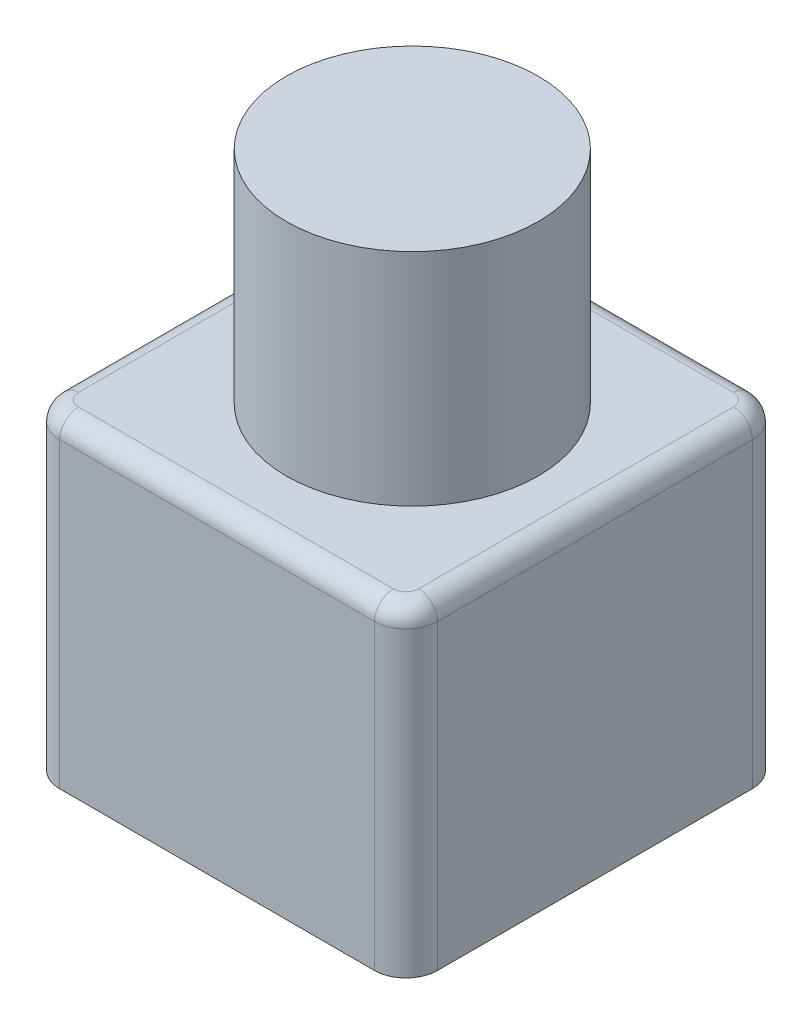
ISO-10303-21;
HEADER;
FILE_DESCRIPTION(('STEP AP214'),'2;1');
FILE_NAME('part.step','',(''),(''),'','','');
FILE_SCHEMA(('AUTOMOTIVE_DESIGN { 1 0 10303 214 1 1 1 1 }'));
ENDSEC;
DATA;
#1=APPLICATION_CONTEXT('core data for automotive mechanical design processes');
#2=APPLICATION_PROTOCOL_DEFINITION('international standard','automotive_design',2000,#1);
#3=PRODUCT_CONTEXT('',#1,'mechanical');
#4=PRODUCT('Part','Part','',(#3));
#5=PRODUCT_RELATED_PRODUCT_CATEGORY('part','',(#4));
#6=PRODUCT_DEFINITION_FORMATION('','',#4);
#7=PRODUCT_DEFINITION_CONTEXT('part definition',#1,'design');
#8=PRODUCT_DEFINITION('design','',#6,#7);
#9=PRODUCT_DEFINITION_SHAPE('','',#8);
#10=(LENGTH_UNIT() NAMED_UNIT(*) SI_UNIT(.MILLI.,.METRE.));
#11=(NAMED_UNIT(*) PLANE_ANGLE_UNIT() SI_UNIT($,.RADIAN.));
#12=(NAMED_UNIT(*) SI_UNIT($,.STERADIAN.) SOLID_ANGLE_UNIT());
#13=UNCERTAINTY_MEASURE_WITH_UNIT(LENGTH_MEASURE(1.E-05),#10,'distance_accuracy_value','');
#14=(GEOMETRIC_REPRESENTATION_CONTEXT(3) GLOBAL_UNCERTAINTY_ASSIGNED_CONTEXT((#13)) GLOBAL_UNIT_ASSIGNED_CONTEXT((#10,
#11,#12)) REPRESENTATION_CONTEXT('',''));
#15=CARTESIAN_POINT('',(0.,0.,0.));
#16=DIRECTION('',(0.,0.,1.));
#17=DIRECTION('',(1.,0.,0.));
#18=AXIS2_PLACEMENT_3D('',#15,#16,#17);
#19=CARTESIAN_POINT('',(-30.,51.,-30.));
#20=DIRECTION('',(1.,0.,0.));
#21=DIRECTION('',(0.,0.,-1.));
#22=AXIS2_PLACEMENT_3D('',#19,#20,#21);
#23=PLANE('',#22);
#24=DIRECTION('',(0.,-1.,0.));
#25=VECTOR('',#24,1.);
#26=CARTESIAN_POINT('',(-30.,51.,25.));
#27=LINE('',#26,#25);
#28=CARTESIAN_POINT('',(-30.,0.,25.));
#29=VERTEX_POINT('',#28);
#30=CARTESIAN_POINT('',(-30.,48.,25.));
#31=VERTEX_POINT('',#30);
#32=EDGE_CURVE('E267',#29,#31,#27,.F.);
#33=ORIENTED_EDGE('',*,*,#32,.T.);
#34=DIRECTION('',(0.,0.,1.));
#35=VECTOR('',#34,1.);
#36=CARTESIAN_POINT('',(-30.,48.,-25.));
#37=LINE('',#36,#35);
#38=CARTESIAN_POINT('',(-30.,48.,-25.));
#39=VERTEX_POINT('',#38);
#40=EDGE_CURVE('E11',#31,#39,#37,.F.);
#41=ORIENTED_EDGE('',*,*,#40,.T.);
#42=DIRECTION('',(0.,-1.,0.));
#43=VECTOR('',#42,1.);
#44=CARTESIAN_POINT('',(-30.,51.,-25.));
#45=LINE('',#44,#43);
#46=CARTESIAN_POINT('',(-30.,0.,-25.));
#47=VERTEX_POINT('',#46);
#48=EDGE_CURVE('E270',#39,#47,#45,.T.);
#49=ORIENTED_EDGE('',*,*,#48,.T.);
#50=DIRECTION('',(0.,0.,1.));
#51=VECTOR('',#50,1.);
#52=CARTESIAN_POINT('',(-30.,0.,-30.));
#53=LINE('',#52,#51);
#54=EDGE_CURVE('E229',#47,#29,#53,.T.);
#55=ORIENTED_EDGE('',*,*,#54,.T.);
#56=EDGE_LOOP('',(#33,#41,#49,#55));
#57=FACE_BOUND('',#56,.T.);
#58=DIRECTION('',(0.,1.,0.));
#59=VECTOR('',#58,1.);
#60=CARTESIAN_POINT('',(-30.,45.,15.));
#61=LINE('',#60,#59);
#62=CARTESIAN_POINT('',(-30.,20.,15.));
#63=VERTEX_POINT('',#62);
#64=CARTESIAN_POINT('',(-30.,45.,15.));
#65=VERTEX_POINT('',#64);
#66=EDGE_CURVE('E196',#63,#65,#61,.T.);
#67=ORIENTED_EDGE('',*,*,#66,.F.);
#68=DIRECTION('',(0.,0.,1.));
#69=VECTOR('',#68,1.);
#70=CARTESIAN_POINT('',(-30.,20.,-15.));
#71=LINE('',#70,#69);
#72=CARTESIAN_POINT('',(-30.,20.,-15.));
#73=VERTEX_POINT('',#72);
#74=EDGE_CURVE('E190',#73,#63,#71,.T.);
#75=ORIENTED_EDGE('',*,*,#74,.F.);
#76=DIRECTION('',(0.,-1.,0.));
#77=VECTOR('',#76,1.);
#78=CARTESIAN_POINT('',(-30.,45.,-15.));
#79=LINE('',#78,#77);
#80=CARTESIAN_POINT('',(-30.,45.,-15.));
#81=VERTEX_POINT('',#80);
#82=EDGE_CURVE('E174',#81,#73,#79,.T.);
#83=ORIENTED_EDGE('',*,*,#82,.F.);
#84=DIRECTION('',(0.,0.,-1.));
#85=VECTOR('',#84,1.);
#86=CARTESIAN_POINT('',(-30.,45.,-15.));
#87=LINE('',#86,#85);
#88=EDGE_CURVE('E187',#65,#81,#87,.T.);
#89=ORIENTED_EDGE('',*,*,#88,.F.);
#90=EDGE_LOOP('',(#67,#75,#83,#89));
#91=FACE_BOUND('',#90,.T.);
#92=ADVANCED_FACE('F41',(#57,#91),#23,.F.);
#93=CARTESIAN_POINT('',(30.,51.,-30.));
#94=DIRECTION('',(-1.,0.,0.));
#95=DIRECTION('',(0.,0.,1.));
#96=AXIS2_PLACEMENT_3D('',#93,#94,#95);
#97=PLANE('',#96);
#98=DIRECTION('',(0.,-1.,0.));
#99=VECTOR('',#98,1.);
#100=CARTESIAN_POINT('',(30.,51.,-25.));
#101=LINE('',#100,#99);
#102=CARTESIAN_POINT('',(30.,0.,-25.));
#103=VERTEX_POINT('',#102);
#104=CARTESIAN_POINT('',(30.,48.,-25.));
#105=VERTEX_POINT('',#104);
#106=EDGE_CURVE('E257',#103,#105,#101,.F.);
#107=ORIENTED_EDGE('',*,*,#106,.T.);
#108=DIRECTION('',(0.,0.,-1.));
#109=VECTOR('',#108,1.);
#110=CARTESIAN_POINT('',(30.,48.,25.));
#111=LINE('',#110,#109);
#112=CARTESIAN_POINT('',(30.,48.,25.));
#113=VERTEX_POINT('',#112);
#114=EDGE_CURVE('E350',#105,#113,#111,.F.);
#115=ORIENTED_EDGE('',*,*,#114,.T.);
#116=DIRECTION('',(0.,-1.,0.));
#117=VECTOR('',#116,1.);
#118=CARTESIAN_POINT('',(30.,51.,25.));
#119=LINE('',#118,#117);
#120=CARTESIAN_POINT('',(30.,0.,25.));
#121=VERTEX_POINT('',#120);
#122=EDGE_CURVE('E254',#113,#121,#119,.T.);
#123=ORIENTED_EDGE('',*,*,#122,.T.);
#124=DIRECTION('',(0.,0.,-1.));
#125=VECTOR('',#124,1.);
#126=CARTESIAN_POINT('',(30.,0.,-30.));
#127=LINE('',#126,#125);
#128=EDGE_CURVE('E215',#121,#103,#127,.T.);
#129=ORIENTED_EDGE('',*,*,#128,.T.);
#130=EDGE_LOOP('',(#107,#115,#123,#129));
#131=FACE_BOUND('',#130,.T.);
#132=ADVANCED_FACE('F409',(#131),#97,.F.);
#133=CARTESIAN_POINT('',(-30.,51.,-30.));
#134=DIRECTION('',(0.,0.,1.));
#135=DIRECTION('',(1.,0.,0.));
#136=AXIS2_PLACEMENT_3D('',#133,#134,#135);
#137=PLANE('',#136);
#138=DIRECTION('',(0.,-1.,0.));
#139=VECTOR('',#138,1.);
#140=CARTESIAN_POINT('',(-25.,51.,-30.));
#141=LINE('',#140,#139);
#142=CARTESIAN_POINT('',(-25.,0.,-30.));
#143=VERTEX_POINT('',#142);
#144=CARTESIAN_POINT('',(-25.,48.,-30.));
#145=VERTEX_POINT('',#144);
#146=EDGE_CURVE('E220',#143,#145,#141,.F.);
#147=ORIENTED_EDGE('',*,*,#146,.T.);
#148=DIRECTION('',(-1.,0.,0.));
#149=VECTOR('',#148,1.);
#150=CARTESIAN_POINT('',(25.,48.,-30.));
#151=LINE('',#150,#149);
#152=CARTESIAN_POINT('',(25.,48.,-30.));
#153=VERTEX_POINT('',#152);
#154=EDGE_CURVE('E347',#145,#153,#151,.F.);
#155=ORIENTED_EDGE('',*,*,#154,.T.);
#156=DIRECTION('',(0.,-1.,0.));
#157=VECTOR('',#156,1.);
#158=CARTESIAN_POINT('',(25.,51.,-30.));
#159=LINE('',#158,#157);
#160=CARTESIAN_POINT('',(25.,0.,-30.));
#161=VERTEX_POINT('',#160);
#162=EDGE_CURVE('E239',#153,#161,#159,.T.);
#163=ORIENTED_EDGE('',*,*,#162,.T.);
#164=DIRECTION('',(-1.,0.,0.));
#165=VECTOR('',#164,1.);
#166=CARTESIAN_POINT('',(-30.,0.,-30.));
#167=LINE('',#166,#165);
#168=EDGE_CURVE('E225',#161,#143,#167,.T.);
#169=ORIENTED_EDGE('',*,*,#168,.T.);
#170=EDGE_LOOP('',(#147,#155,#163,#169));
#171=FACE_BOUND('',#170,.T.);
#172=ADVANCED_FACE('F459',(#171),#137,.F.);
#173=CARTESIAN_POINT('',(-30.,51.,30.));
#174=DIRECTION('',(0.,0.,-1.));
#175=DIRECTION('',(-1.,0.,0.));
#176=AXIS2_PLACEMENT_3D('',#173,#174,#175);
#177=PLANE('',#176);
#178=DIRECTION('',(0.,-1.,0.));
#179=VECTOR('',#178,1.);
#180=CARTESIAN_POINT('',(25.,51.,30.));
#181=LINE('',#180,#179);
#182=CARTESIAN_POINT('',(25.,0.,30.));
#183=VERTEX_POINT('',#182);
#184=CARTESIAN_POINT('',(25.,48.,30.));
#185=VERTEX_POINT('',#184);
#186=EDGE_CURVE('E264',#183,#185,#181,.F.);
#187=ORIENTED_EDGE('',*,*,#186,.T.);
#188=DIRECTION('',(1.,0.,0.));
#189=VECTOR('',#188,1.);
#190=CARTESIAN_POINT('',(-25.,48.,30.));
#191=LINE('',#190,#189);
#192=CARTESIAN_POINT('',(-25.,48.,30.));
#193=VERTEX_POINT('',#192);
#194=EDGE_CURVE('E51',#185,#193,#191,.F.);
#195=ORIENTED_EDGE('',*,*,#194,.T.);
#196=DIRECTION('',(0.,-1.,0.));
#197=VECTOR('',#196,1.);
#198=CARTESIAN_POINT('',(-25.,51.,30.));
#199=LINE('',#198,#197);
#200=CARTESIAN_POINT('',(-25.,0.,30.));
#201=VERTEX_POINT('',#200);
#202=EDGE_CURVE('E261',#193,#201,#199,.T.);
#203=ORIENTED_EDGE('',*,*,#202,.T.);
#204=DIRECTION('',(1.,0.,0.));
#205=VECTOR('',#204,1.);
#206=CARTESIAN_POINT('',(-30.,0.,30.));
#207=LINE('',#206,#205);
#208=EDGE_CURVE('E221',#201,#183,#207,.T.);
#209=ORIENTED_EDGE('',*,*,#208,.T.);
#210=EDGE_LOOP('',(#187,#195,#203,#209));
#211=FACE_BOUND('',#210,.T.);
#212=ADVANCED_FACE('F398',(#211),#177,.F.);
#213=CARTESIAN_POINT('',(0.,51.,0.));
#214=DIRECTION('',(0.,1.,0.));
#215=DIRECTION('',(0.,0.,1.));
#216=AXIS2_PLACEMENT_3D('',#213,#214,#215);
#217=PLANE('',#216);
#218=CARTESIAN_POINT('',(25.,51.,25.));
#219=DIRECTION('',(0.,1.,0.));
#220=DIRECTION('',(0.,0.,1.));
#221=AXIS2_PLACEMENT_3D('',#218,#219,#220);
#222=CIRCLE('',#221,2.);
#223=CARTESIAN_POINT('',(25.,51.,27.));
#224=VERTEX_POINT('',#223);
#225=CARTESIAN_POINT('',(27.,51.,25.));
#226=VERTEX_POINT('',#225);
#227=EDGE_CURVE('E326',#224,#226,#222,.T.);
#228=ORIENTED_EDGE('',*,*,#227,.T.);
#229=DIRECTION('',(0.,0.,-1.));
#230=VECTOR('',#229,1.);
#231=CARTESIAN_POINT('',(27.,51.,-25.));
#232=LINE('',#231,#230);
#233=CARTESIAN_POINT('',(27.,51.,-25.));
#234=VERTEX_POINT('',#233);
#235=EDGE_CURVE('E332',#226,#234,#232,.T.);
#236=ORIENTED_EDGE('',*,*,#235,.T.);
#237=CARTESIAN_POINT('',(25.,51.,-25.));
#238=DIRECTION('',(0.,1.,0.));
#239=DIRECTION('',(0.,0.,1.));
#240=AXIS2_PLACEMENT_3D('',#237,#238,#239);
#241=CIRCLE('',#240,2.);
#242=CARTESIAN_POINT('',(25.,51.,-27.));
#243=VERTEX_POINT('',#242);
#244=EDGE_CURVE('E329',#234,#243,#241,.T.);
#245=ORIENTED_EDGE('',*,*,#244,.T.);
#246=DIRECTION('',(-1.,0.,0.));
#247=VECTOR('',#246,1.);
#248=CARTESIAN_POINT('',(-25.,51.,-27.));
#249=LINE('',#248,#247);
#250=CARTESIAN_POINT('',(-25.,51.,-27.));
#251=VERTEX_POINT('',#250);
#252=EDGE_CURVE('E323',#243,#251,#249,.T.);
#253=ORIENTED_EDGE('',*,*,#252,.T.);
#254=CARTESIAN_POINT('',(-25.,51.,-25.));
#255=DIRECTION('',(0.,1.,0.));
#256=DIRECTION('',(0.,0.,1.));
#257=AXIS2_PLACEMENT_3D('',#254,#255,#256);
#258=CIRCLE('',#257,2.);
#259=CARTESIAN_POINT('',(-27.,51.,-25.));
#260=VERTEX_POINT('',#259);
#261=EDGE_CURVE('E316',#251,#260,#258,.T.);
#262=ORIENTED_EDGE('',*,*,#261,.T.);
#263=DIRECTION('',(0.,0.,1.));
#264=VECTOR('',#263,1.);
#265=CARTESIAN_POINT('',(-27.,51.,25.));
#266=LINE('',#265,#264);
#267=CARTESIAN_POINT('',(-27.,51.,25.));
#268=VERTEX_POINT('',#267);
#269=EDGE_CURVE('E297',#260,#268,#266,.T.);
#270=ORIENTED_EDGE('',*,*,#269,.T.);
#271=CARTESIAN_POINT('',(-25.,51.,25.));
#272=DIRECTION('',(0.,1.,0.));
#273=DIRECTION('',(0.,0.,1.));
#274=AXIS2_PLACEMENT_3D('',#271,#272,#273);
#275=CIRCLE('',#274,2.);
#276=CARTESIAN_POINT('',(-25.,51.,27.));
#277=VERTEX_POINT('',#276);
#278=EDGE_CURVE('E313',#268,#277,#275,.T.);
#279=ORIENTED_EDGE('',*,*,#278,.T.);
#280=DIRECTION('',(1.,0.,0.));
#281=VECTOR('',#280,1.);
#282=CARTESIAN_POINT('',(25.,51.,27.));
#283=LINE('',#282,#281);
#284=EDGE_CURVE('E320',#277,#224,#283,.T.);
#285=ORIENTED_EDGE('',*,*,#284,.T.);
#286=EDGE_LOOP('',(#228,#236,#245,#253,#262,#270,#279,#285));
#287=FACE_BOUND('',#286,.T.);
#288=CARTESIAN_POINT('',(1.,51.,0.));
#289=DIRECTION('',(0.,1.,0.));
#290=DIRECTION('',(0.,0.,1.));
#291=AXIS2_PLACEMENT_3D('',#288,#289,#290);
#292=CIRCLE('',#291,20.);
#293=CARTESIAN_POINT('',(1.,51.,20.));
#294=VERTEX_POINT('',#293);
#295=EDGE_CURVE('E216',#294,#294,#292,.T.);
#296=ORIENTED_EDGE('',*,*,#295,.F.);
#297=EDGE_LOOP('',(#296));
#298=FACE_BOUND('',#297,.T.);
#299=ADVANCED_FACE('F425',(#287,#298),#217,.T.);
#300=CARTESIAN_POINT('',(0.,0.,0.));
#301=DIRECTION('',(0.,1.,0.));
#302=DIRECTION('',(0.,0.,1.));
#303=AXIS2_PLACEMENT_3D('',#300,#301,#302);
#304=PLANE('',#303);
#305=ORIENTED_EDGE('',*,*,#168,.F.);
#306=CARTESIAN_POINT('',(25.,0.,-25.));
#307=DIRECTION('',(0.,1.,0.));
#308=DIRECTION('',(0.,0.,1.));
#309=AXIS2_PLACEMENT_3D('',#306,#307,#308);
#310=CIRCLE('',#309,5.);
#311=EDGE_CURVE('E251',#161,#103,#310,.F.);
#312=ORIENTED_EDGE('',*,*,#311,.T.);
#313=ORIENTED_EDGE('',*,*,#128,.F.);
#314=CARTESIAN_POINT('',(25.,0.,25.));
#315=DIRECTION('',(0.,1.,0.));
#316=DIRECTION('',(0.,0.,1.));
#317=AXIS2_PLACEMENT_3D('',#314,#315,#316);
#318=CIRCLE('',#317,5.);
#319=EDGE_CURVE('E248',#121,#183,#318,.F.);
#320=ORIENTED_EDGE('',*,*,#319,.T.);
#321=ORIENTED_EDGE('',*,*,#208,.F.);
#322=CARTESIAN_POINT('',(-25.,0.,25.));
#323=DIRECTION('',(0.,1.,0.));
#324=DIRECTION('',(0.,0.,1.));
#325=AXIS2_PLACEMENT_3D('',#322,#323,#324);
#326=CIRCLE('',#325,5.);
#327=EDGE_CURVE('E242',#201,#29,#326,.F.);
#328=ORIENTED_EDGE('',*,*,#327,.T.);
#329=ORIENTED_EDGE('',*,*,#54,.F.);
#330=CARTESIAN_POINT('',(-25.,0.,-25.));
#331=DIRECTION('',(0.,1.,0.));
#332=DIRECTION('',(0.,0.,1.));
#333=AXIS2_PLACEMENT_3D('',#330,#331,#332);
#334=CIRCLE('',#333,5.);
#335=EDGE_CURVE('E245',#47,#143,#334,.F.);
#336=ORIENTED_EDGE('',*,*,#335,.T.);
#337=EDGE_LOOP('',(#305,#312,#313,#320,#321,#328,#329,#336));
#338=FACE_BOUND('',#337,.T.);
#339=ADVANCED_FACE('F403',(#338),#304,.F.);
#340=CARTESIAN_POINT('',(1.,86.,0.));
#341=DIRECTION('',(0.,-1.,0.));
#342=DIRECTION('',(0.,0.,-1.));
#343=AXIS2_PLACEMENT_3D('',#340,#341,#342);
#344=CYLINDRICAL_SURFACE('',#343,20.);
#345=CARTESIAN_POINT('',(1.,86.,0.));
#346=DIRECTION('',(0.,1.,0.));
#347=DIRECTION('',(0.,0.,1.));
#348=AXIS2_PLACEMENT_3D('',#345,#346,#347);
#349=CIRCLE('',#348,20.);
#350=CARTESIAN_POINT('',(1.,86.,20.));
#351=VERTEX_POINT('',#350);
#352=EDGE_CURVE('E211',#351,#351,#349,.T.);
#353=ORIENTED_EDGE('',*,*,#352,.F.);
#354=EDGE_LOOP('',(#353));
#355=FACE_BOUND('',#354,.T.);
#356=ORIENTED_EDGE('',*,*,#295,.T.);
#357=EDGE_LOOP('',(#356));
#358=FACE_BOUND('',#357,.T.);
#359=ADVANCED_FACE('F517',(#355,#358),#344,.T.);
#360=CARTESIAN_POINT('',(1.,86.,0.));
#361=DIRECTION('',(0.,1.,0.));
#362=DIRECTION('',(0.,0.,1.));
#363=AXIS2_PLACEMENT_3D('',#360,#361,#362);
#364=PLANE('',#363);
#365=ORIENTED_EDGE('',*,*,#352,.T.);
#366=EDGE_LOOP('',(#365));
#367=FACE_BOUND('',#366,.T.);
#368=ADVANCED_FACE('F510',(#367),#364,.T.);
#369=CARTESIAN_POINT('',(-32.,45.,15.));
#370=DIRECTION('',(0.,0.,-1.));
#371=DIRECTION('',(0.,1.,0.));
#372=AXIS2_PLACEMENT_3D('',#369,#370,#371);
#373=PLANE('',#372);
#374=DIRECTION('',(1.,0.,0.));
#375=VECTOR('',#374,1.);
#376=CARTESIAN_POINT('',(-32.,45.,15.));
#377=LINE('',#376,#375);
#378=CARTESIAN_POINT('',(-31.5,45.,15.));
#379=VERTEX_POINT('',#378);
#380=EDGE_CURVE('E180',#379,#65,#377,.T.);
#381=ORIENTED_EDGE('',*,*,#380,.F.);
#382=DIRECTION('',(0.,1.,0.));
#383=VECTOR('',#382,1.);
#384=CARTESIAN_POINT('',(-31.5,20.,15.));
#385=LINE('',#384,#383);
#386=CARTESIAN_POINT('',(-31.5,20.,15.));
#387=VERTEX_POINT('',#386);
#388=EDGE_CURVE('E291',#379,#387,#385,.F.);
#389=ORIENTED_EDGE('',*,*,#388,.T.);
#390=DIRECTION('',(1.,0.,0.));
#391=VECTOR('',#390,1.);
#392=CARTESIAN_POINT('',(-32.,20.,15.));
#393=LINE('',#392,#391);
#394=EDGE_CURVE('E204',#387,#63,#393,.T.);
#395=ORIENTED_EDGE('',*,*,#394,.T.);
#396=ORIENTED_EDGE('',*,*,#66,.T.);
#397=EDGE_LOOP('',(#381,#389,#395,#396));
#398=FACE_BOUND('',#397,.T.);
#399=ADVANCED_FACE('F508',(#398),#373,.F.);
#400=CARTESIAN_POINT('',(-32.,45.,-15.));
#401=DIRECTION('',(0.,-1.,0.));
#402=DIRECTION('',(0.,0.,-1.));
#403=AXIS2_PLACEMENT_3D('',#400,#401,#402);
#404=PLANE('',#403);
#405=DIRECTION('',(1.,0.,0.));
#406=VECTOR('',#405,1.);
#407=CARTESIAN_POINT('',(-32.,45.,-15.));
#408=LINE('',#407,#406);
#409=CARTESIAN_POINT('',(-31.5,45.,-15.));
#410=VERTEX_POINT('',#409);
#411=EDGE_CURVE('E170',#410,#81,#408,.T.);
#412=ORIENTED_EDGE('',*,*,#411,.F.);
#413=DIRECTION('',(0.,0.,-1.));
#414=VECTOR('',#413,1.);
#415=CARTESIAN_POINT('',(-31.5,45.,15.));
#416=LINE('',#415,#414);
#417=EDGE_CURVE('E294',#410,#379,#416,.F.);
#418=ORIENTED_EDGE('',*,*,#417,.T.);
#419=ORIENTED_EDGE('',*,*,#380,.T.);
#420=ORIENTED_EDGE('',*,*,#88,.T.);
#421=EDGE_LOOP('',(#412,#418,#419,#420));
#422=FACE_BOUND('',#421,.T.);
#423=ADVANCED_FACE('F193',(#422),#404,.F.);
#424=CARTESIAN_POINT('',(-32.,45.,-15.));
#425=DIRECTION('',(0.,0.,1.));
#426=DIRECTION('',(1.,0.,0.));
#427=AXIS2_PLACEMENT_3D('',#424,#425,#426);
#428=PLANE('',#427);
#429=DIRECTION('',(1.,0.,0.));
#430=VECTOR('',#429,1.);
#431=CARTESIAN_POINT('',(-32.,20.,-15.));
#432=LINE('',#431,#430);
#433=CARTESIAN_POINT('',(-31.5,20.,-15.));
#434=VERTEX_POINT('',#433);
#435=EDGE_CURVE('E181',#434,#73,#432,.T.);
#436=ORIENTED_EDGE('',*,*,#435,.F.);
#437=DIRECTION('',(0.,-1.,0.));
#438=VECTOR('',#437,1.);
#439=CARTESIAN_POINT('',(-31.5,45.,-15.));
#440=LINE('',#439,#438);
#441=EDGE_CURVE('E176',#434,#410,#440,.F.);
#442=ORIENTED_EDGE('',*,*,#441,.T.);
#443=ORIENTED_EDGE('',*,*,#411,.T.);
#444=ORIENTED_EDGE('',*,*,#82,.T.);
#445=EDGE_LOOP('',(#436,#442,#443,#444));
#446=FACE_BOUND('',#445,.T.);
#447=ADVANCED_FACE('F173',(#446),#428,.F.);
#448=CARTESIAN_POINT('',(-32.,20.,-15.));
#449=DIRECTION('',(0.,1.,0.));
#450=DIRECTION('',(0.,0.,1.));
#451=AXIS2_PLACEMENT_3D('',#448,#449,#450);
#452=PLANE('',#451);
#453=ORIENTED_EDGE('',*,*,#394,.F.);
#454=DIRECTION('',(0.,0.,1.));
#455=VECTOR('',#454,1.);
#456=CARTESIAN_POINT('',(-31.5,20.,-15.));
#457=LINE('',#456,#455);
#458=EDGE_CURVE('E288',#387,#434,#457,.F.);
#459=ORIENTED_EDGE('',*,*,#458,.T.);
#460=ORIENTED_EDGE('',*,*,#435,.T.);
#461=ORIENTED_EDGE('',*,*,#74,.T.);
#462=EDGE_LOOP('',(#453,#459,#460,#461));
#463=FACE_BOUND('',#462,.T.);
#464=ADVANCED_FACE('F502',(#463),#452,.F.);
#465=CARTESIAN_POINT('',(-32.,0.,0.));
#466=DIRECTION('',(-1.,0.,0.));
#467=DIRECTION('',(0.,-1.,0.));
#468=AXIS2_PLACEMENT_3D('',#465,#466,#467);
#469=PLANE('',#468);
#470=DIRECTION('',(0.,0.,-1.));
#471=VECTOR('',#470,1.);
#472=CARTESIAN_POINT('',(-32.,44.5,-15.));
#473=LINE('',#472,#471);
#474=CARTESIAN_POINT('',(-32.,44.5,14.5));
#475=VERTEX_POINT('',#474);
#476=CARTESIAN_POINT('',(-32.,44.5,-14.5));
#477=VERTEX_POINT('',#476);
#478=EDGE_CURVE('E273',#475,#477,#473,.T.);
#479=ORIENTED_EDGE('',*,*,#478,.T.);
#480=DIRECTION('',(0.,-1.,0.));
#481=VECTOR('',#480,1.);
#482=CARTESIAN_POINT('',(-32.,20.,-14.5));
#483=LINE('',#482,#481);
#484=CARTESIAN_POINT('',(-32.,20.5,-14.5));
#485=VERTEX_POINT('',#484);
#486=EDGE_CURVE('E282',#477,#485,#483,.T.);
#487=ORIENTED_EDGE('',*,*,#486,.T.);
#488=DIRECTION('',(0.,0.,1.));
#489=VECTOR('',#488,1.);
#490=CARTESIAN_POINT('',(-32.,20.5,15.));
#491=LINE('',#490,#489);
#492=CARTESIAN_POINT('',(-32.,20.5,14.5));
#493=VERTEX_POINT('',#492);
#494=EDGE_CURVE('E279',#485,#493,#491,.T.);
#495=ORIENTED_EDGE('',*,*,#494,.T.);
#496=DIRECTION('',(0.,1.,0.));
#497=VECTOR('',#496,1.);
#498=CARTESIAN_POINT('',(-32.,45.,14.5));
#499=LINE('',#498,#497);
#500=EDGE_CURVE('E276',#493,#475,#499,.T.);
#501=ORIENTED_EDGE('',*,*,#500,.T.);
#502=EDGE_LOOP('',(#479,#487,#495,#501));
#503=FACE_BOUND('',#502,.T.);
#504=ADVANCED_FACE('F469',(#503),#469,.T.);
#505=CARTESIAN_POINT('',(25.,51.,-25.));
#506=DIRECTION('',(0.,-1.,0.));
#507=DIRECTION('',(0.,0.,-1.));
#508=AXIS2_PLACEMENT_3D('',#505,#506,#507);
#509=CYLINDRICAL_SURFACE('',#508,5.);
#510=ORIENTED_EDGE('',*,*,#162,.F.);
#511=CARTESIAN_POINT('',(25.,48.,-25.));
#512=DIRECTION('',(0.,1.,0.));
#513=DIRECTION('',(0.,0.,1.));
#514=AXIS2_PLACEMENT_3D('',#511,#512,#513);
#515=CIRCLE('',#514,5.);
#516=EDGE_CURVE('E339',#153,#105,#515,.F.);
#517=ORIENTED_EDGE('',*,*,#516,.T.);
#518=ORIENTED_EDGE('',*,*,#106,.F.);
#519=ORIENTED_EDGE('',*,*,#311,.F.);
#520=EDGE_LOOP('',(#510,#517,#518,#519));
#521=FACE_BOUND('',#520,.T.);
#522=ADVANCED_FACE('F412',(#521),#509,.T.);
#523=CARTESIAN_POINT('',(25.,51.,25.));
#524=DIRECTION('',(0.,-1.,0.));
#525=DIRECTION('',(0.,0.,-1.));
#526=AXIS2_PLACEMENT_3D('',#523,#524,#525);
#527=CYLINDRICAL_SURFACE('',#526,5.);
#528=ORIENTED_EDGE('',*,*,#122,.F.);
#529=CARTESIAN_POINT('',(25.,48.,25.));
#530=DIRECTION('',(0.,1.,0.));
#531=DIRECTION('',(0.,0.,1.));
#532=AXIS2_PLACEMENT_3D('',#529,#530,#531);
#533=CIRCLE('',#532,5.);
#534=EDGE_CURVE('E342',#113,#185,#533,.F.);
#535=ORIENTED_EDGE('',*,*,#534,.T.);
#536=ORIENTED_EDGE('',*,*,#186,.F.);
#537=ORIENTED_EDGE('',*,*,#319,.F.);
#538=EDGE_LOOP('',(#528,#535,#536,#537));
#539=FACE_BOUND('',#538,.T.);
#540=ADVANCED_FACE('F396',(#539),#527,.T.);
#541=CARTESIAN_POINT('',(-25.,51.,-25.));
#542=DIRECTION('',(0.,-1.,0.));
#543=DIRECTION('',(0.,0.,-1.));
#544=AXIS2_PLACEMENT_3D('',#541,#542,#543);
#545=CYLINDRICAL_SURFACE('',#544,5.);
#546=ORIENTED_EDGE('',*,*,#48,.F.);
#547=CARTESIAN_POINT('',(-25.,48.,-25.));
#548=DIRECTION('',(0.,1.,0.));
#549=DIRECTION('',(0.,0.,1.));
#550=AXIS2_PLACEMENT_3D('',#547,#548,#549);
#551=CIRCLE('',#550,5.);
#552=EDGE_CURVE('E335',#39,#145,#551,.F.);
#553=ORIENTED_EDGE('',*,*,#552,.T.);
#554=ORIENTED_EDGE('',*,*,#146,.F.);
#555=ORIENTED_EDGE('',*,*,#335,.F.);
#556=EDGE_LOOP('',(#546,#553,#554,#555));
#557=FACE_BOUND('',#556,.T.);
#558=ADVANCED_FACE('F443',(#557),#545,.T.);
#559=CARTESIAN_POINT('',(-25.,51.,25.));
#560=DIRECTION('',(0.,-1.,0.));
#561=DIRECTION('',(0.,0.,-1.));
#562=AXIS2_PLACEMENT_3D('',#559,#560,#561);
#563=CYLINDRICAL_SURFACE('',#562,5.);
#564=ORIENTED_EDGE('',*,*,#202,.F.);
#565=CARTESIAN_POINT('',(-25.,48.,25.));
#566=DIRECTION('',(0.,1.,0.));
#567=DIRECTION('',(0.,0.,1.));
#568=AXIS2_PLACEMENT_3D('',#565,#566,#567);
#569=CIRCLE('',#568,5.);
#570=EDGE_CURVE('E65',#193,#31,#569,.F.);
#571=ORIENTED_EDGE('',*,*,#570,.T.);
#572=ORIENTED_EDGE('',*,*,#32,.F.);
#573=ORIENTED_EDGE('',*,*,#327,.F.);
#574=EDGE_LOOP('',(#564,#571,#572,#573));
#575=FACE_BOUND('',#574,.T.);
#576=ADVANCED_FACE('F474',(#575),#563,.T.);
#577=CARTESIAN_POINT('',(-31.5,0.,14.5));
#578=DIRECTION('',(0.,-1.,0.));
#579=DIRECTION('',(0.,0.,-1.));
#580=AXIS2_PLACEMENT_3D('',#577,#578,#579);
#581=CYLINDRICAL_SURFACE('',#580,0.5);
#582=CARTESIAN_POINT('',(-31.5,20.5,14.5));
#583=DIRECTION('',(0.,-0.707106781186547,-0.707106781186547));
#584=DIRECTION('',(0.,-0.707106781186547,0.707106781186547));
#585=AXIS2_PLACEMENT_3D('',#582,#583,#584);
#586=ELLIPSE('',#585,0.707106781186548,0.5);
#587=EDGE_CURVE('E304',#387,#493,#586,.T.);
#588=ORIENTED_EDGE('',*,*,#587,.F.);
#589=ORIENTED_EDGE('',*,*,#388,.F.);
#590=CARTESIAN_POINT('',(-31.5,44.5,14.5));
#591=DIRECTION('',(0.,-0.707106781186547,0.707106781186548));
#592=DIRECTION('',(0.,0.707106781186548,0.707106781186547));
#593=AXIS2_PLACEMENT_3D('',#590,#591,#592);
#594=ELLIPSE('',#593,0.707106781186547,0.5);
#595=EDGE_CURVE('E199',#475,#379,#594,.F.);
#596=ORIENTED_EDGE('',*,*,#595,.F.);
#597=ORIENTED_EDGE('',*,*,#500,.F.);
#598=EDGE_LOOP('',(#588,#589,#596,#597));
#599=FACE_BOUND('',#598,.T.);
#600=ADVANCED_FACE('F477',(#599),#581,.T.);
#601=CARTESIAN_POINT('',(-31.5,44.5,0.));
#602=DIRECTION('',(0.,0.,1.));
#603=DIRECTION('',(1.,0.,0.));
#604=AXIS2_PLACEMENT_3D('',#601,#602,#603);
#605=CYLINDRICAL_SURFACE('',#604,0.5);
#606=ORIENTED_EDGE('',*,*,#595,.T.);
#607=ORIENTED_EDGE('',*,*,#417,.F.);
#608=CARTESIAN_POINT('',(-31.5,44.5,-14.5));
#609=DIRECTION('',(0.,0.707106781186548,0.707106781186547));
#610=DIRECTION('',(0.,-0.707106781186547,0.707106781186547));
#611=AXIS2_PLACEMENT_3D('',#608,#609,#610);
#612=ELLIPSE('',#611,0.707106781186548,0.5);
#613=EDGE_CURVE('E301',#477,#410,#612,.F.);
#614=ORIENTED_EDGE('',*,*,#613,.F.);
#615=ORIENTED_EDGE('',*,*,#478,.F.);
#616=EDGE_LOOP('',(#606,#607,#614,#615));
#617=FACE_BOUND('',#616,.T.);
#618=ADVANCED_FACE('F485',(#617),#605,.T.);
#619=CARTESIAN_POINT('',(-31.5,20.5,0.));
#620=DIRECTION('',(0.,0.,-1.));
#621=DIRECTION('',(0.,1.,0.));
#622=AXIS2_PLACEMENT_3D('',#619,#620,#621);
#623=CYLINDRICAL_SURFACE('',#622,0.5);
#624=ORIENTED_EDGE('',*,*,#587,.T.);
#625=ORIENTED_EDGE('',*,*,#494,.F.);
#626=CARTESIAN_POINT('',(-31.5,20.5,-14.5));
#627=DIRECTION('',(0.,0.707106781186548,-0.707106781186547));
#628=DIRECTION('',(0.,-0.707106781186547,-0.707106781186547));
#629=AXIS2_PLACEMENT_3D('',#626,#627,#628);
#630=ELLIPSE('',#629,0.707106781186547,0.5);
#631=EDGE_CURVE('E298',#434,#485,#630,.T.);
#632=ORIENTED_EDGE('',*,*,#631,.F.);
#633=ORIENTED_EDGE('',*,*,#458,.F.);
#634=EDGE_LOOP('',(#624,#625,#632,#633));
#635=FACE_BOUND('',#634,.T.);
#636=ADVANCED_FACE('F481',(#635),#623,.T.);
#637=CARTESIAN_POINT('',(-31.5,0.,-14.5));
#638=DIRECTION('',(0.,1.,0.));
#639=DIRECTION('',(-1.,0.,0.));
#640=AXIS2_PLACEMENT_3D('',#637,#638,#639);
#641=CYLINDRICAL_SURFACE('',#640,0.5);
#642=ORIENTED_EDGE('',*,*,#613,.T.);
#643=ORIENTED_EDGE('',*,*,#441,.F.);
#644=ORIENTED_EDGE('',*,*,#631,.T.);
#645=ORIENTED_EDGE('',*,*,#486,.F.);
#646=EDGE_LOOP('',(#642,#643,#644,#645));
#647=FACE_BOUND('',#646,.T.);
#648=ADVANCED_FACE('F478',(#647),#641,.T.);
#649=CARTESIAN_POINT('',(25.,48.,25.));
#650=DIRECTION('',(0.,1.,0.));
#651=DIRECTION('',(0.,0.,1.));
#652=AXIS2_PLACEMENT_3D('',#649,#650,#651);
#653=DEGENERATE_TOROIDAL_SURFACE('',#652,2.,3.,.T.);
#654=CARTESIAN_POINT('',(25.,48.,27.));
#655=DIRECTION('',(-1.,0.,0.));
#656=DIRECTION('',(0.,0.,1.));
#657=AXIS2_PLACEMENT_3D('',#654,#655,#656);
#658=CIRCLE('',#657,3.);
#659=EDGE_CURVE('E376',#185,#224,#658,.T.);
#660=ORIENTED_EDGE('',*,*,#659,.F.);
#661=ORIENTED_EDGE('',*,*,#534,.F.);
#662=CARTESIAN_POINT('',(27.,48.,25.));
#663=DIRECTION('',(0.,0.,-1.));
#664=DIRECTION('',(-1.,0.,0.));
#665=AXIS2_PLACEMENT_3D('',#662,#663,#664);
#666=CIRCLE('',#665,3.);
#667=EDGE_CURVE('E45',#226,#113,#666,.T.);
#668=ORIENTED_EDGE('',*,*,#667,.F.);
#669=ORIENTED_EDGE('',*,*,#227,.F.);
#670=EDGE_LOOP('',(#660,#661,#668,#669));
#671=FACE_BOUND('',#670,.T.);
#672=ADVANCED_FACE('F43',(#671),#653,.T.);
#673=CARTESIAN_POINT('',(27.,48.,0.));
#674=DIRECTION('',(0.,0.,1.));
#675=DIRECTION('',(1.,0.,0.));
#676=AXIS2_PLACEMENT_3D('',#673,#674,#675);
#677=CYLINDRICAL_SURFACE('',#676,3.);
#678=ORIENTED_EDGE('',*,*,#667,.T.);
#679=ORIENTED_EDGE('',*,*,#114,.F.);
#680=CARTESIAN_POINT('',(27.,48.,-25.));
#681=DIRECTION('',(0.,0.,-1.));
#682=DIRECTION('',(-1.,0.,0.));
#683=AXIS2_PLACEMENT_3D('',#680,#681,#682);
#684=CIRCLE('',#683,3.);
#685=EDGE_CURVE('E373',#234,#105,#684,.T.);
#686=ORIENTED_EDGE('',*,*,#685,.F.);
#687=ORIENTED_EDGE('',*,*,#235,.F.);
#688=EDGE_LOOP('',(#678,#679,#686,#687));
#689=FACE_BOUND('',#688,.T.);
#690=ADVANCED_FACE('F388',(#689),#677,.T.);
#691=CARTESIAN_POINT('',(0.,48.,27.));
#692=DIRECTION('',(-1.,0.,0.));
#693=DIRECTION('',(0.,0.,1.));
#694=AXIS2_PLACEMENT_3D('',#691,#692,#693);
#695=CYLINDRICAL_SURFACE('',#694,3.);
#696=ORIENTED_EDGE('',*,*,#659,.T.);
#697=ORIENTED_EDGE('',*,*,#284,.F.);
#698=CARTESIAN_POINT('',(-25.,48.,27.));
#699=DIRECTION('',(-1.,0.,0.));
#700=DIRECTION('',(0.,0.,1.));
#701=AXIS2_PLACEMENT_3D('',#698,#699,#700);
#702=CIRCLE('',#701,3.);
#703=EDGE_CURVE('E369',#193,#277,#702,.T.);
#704=ORIENTED_EDGE('',*,*,#703,.F.);
#705=ORIENTED_EDGE('',*,*,#194,.F.);
#706=EDGE_LOOP('',(#696,#697,#704,#705));
#707=FACE_BOUND('',#706,.T.);
#708=ADVANCED_FACE('F429',(#707),#695,.T.);
#709=CARTESIAN_POINT('',(25.,48.,-25.));
#710=DIRECTION('',(0.,1.,0.));
#711=DIRECTION('',(0.,0.,1.));
#712=AXIS2_PLACEMENT_3D('',#709,#710,#711);
#713=DEGENERATE_TOROIDAL_SURFACE('',#712,2.,3.,.T.);
#714=ORIENTED_EDGE('',*,*,#685,.T.);
#715=ORIENTED_EDGE('',*,*,#516,.F.);
#716=CARTESIAN_POINT('',(25.,48.,-27.));
#717=DIRECTION('',(-1.,0.,0.));
#718=DIRECTION('',(0.,0.,1.));
#719=AXIS2_PLACEMENT_3D('',#716,#717,#718);
#720=CIRCLE('',#719,3.);
#721=EDGE_CURVE('E365',#243,#153,#720,.T.);
#722=ORIENTED_EDGE('',*,*,#721,.F.);
#723=ORIENTED_EDGE('',*,*,#244,.F.);
#724=EDGE_LOOP('',(#714,#715,#722,#723));
#725=FACE_BOUND('',#724,.T.);
#726=ADVANCED_FACE('F416',(#725),#713,.T.);
#727=CARTESIAN_POINT('',(-25.,48.,25.));
#728=DIRECTION('',(0.,1.,0.));
#729=DIRECTION('',(0.,0.,1.));
#730=AXIS2_PLACEMENT_3D('',#727,#728,#729);
#731=DEGENERATE_TOROIDAL_SURFACE('',#730,2.,3.,.T.);
#732=ORIENTED_EDGE('',*,*,#703,.T.);
#733=ORIENTED_EDGE('',*,*,#278,.F.);
#734=CARTESIAN_POINT('',(-27.,48.,25.));
#735=DIRECTION('',(0.,0.,-1.));
#736=DIRECTION('',(-1.,0.,0.));
#737=AXIS2_PLACEMENT_3D('',#734,#735,#736);
#738=CIRCLE('',#737,3.);
#739=EDGE_CURVE('E361',#31,#268,#738,.T.);
#740=ORIENTED_EDGE('',*,*,#739,.F.);
#741=ORIENTED_EDGE('',*,*,#570,.F.);
#742=EDGE_LOOP('',(#732,#733,#740,#741));
#743=FACE_BOUND('',#742,.T.);
#744=ADVANCED_FACE('F431',(#743),#731,.T.);
#745=CARTESIAN_POINT('',(0.,48.,-27.));
#746=DIRECTION('',(1.,0.,0.));
#747=DIRECTION('',(0.,0.,-1.));
#748=AXIS2_PLACEMENT_3D('',#745,#746,#747);
#749=CYLINDRICAL_SURFACE('',#748,3.);
#750=ORIENTED_EDGE('',*,*,#721,.T.);
#751=ORIENTED_EDGE('',*,*,#154,.F.);
#752=CARTESIAN_POINT('',(-25.,48.,-27.));
#753=DIRECTION('',(-1.,0.,0.));
#754=DIRECTION('',(0.,0.,1.));
#755=AXIS2_PLACEMENT_3D('',#752,#753,#754);
#756=CIRCLE('',#755,3.);
#757=EDGE_CURVE('E358',#251,#145,#756,.T.);
#758=ORIENTED_EDGE('',*,*,#757,.F.);
#759=ORIENTED_EDGE('',*,*,#252,.F.);
#760=EDGE_LOOP('',(#750,#751,#758,#759));
#761=FACE_BOUND('',#760,.T.);
#762=ADVANCED_FACE('F421',(#761),#749,.T.);
#763=CARTESIAN_POINT('',(-27.,48.,0.));
#764=DIRECTION('',(0.,0.,-1.));
#765=DIRECTION('',(-1.,0.,0.));
#766=AXIS2_PLACEMENT_3D('',#763,#764,#765);
#767=CYLINDRICAL_SURFACE('',#766,3.);
#768=ORIENTED_EDGE('',*,*,#739,.T.);
#769=ORIENTED_EDGE('',*,*,#269,.F.);
#770=CARTESIAN_POINT('',(-27.,48.,-25.));
#771=DIRECTION('',(0.,0.,-1.));
#772=DIRECTION('',(-1.,0.,0.));
#773=AXIS2_PLACEMENT_3D('',#770,#771,#772);
#774=CIRCLE('',#773,3.);
#775=EDGE_CURVE('E355',#39,#260,#774,.T.);
#776=ORIENTED_EDGE('',*,*,#775,.F.);
#777=ORIENTED_EDGE('',*,*,#40,.F.);
#778=EDGE_LOOP('',(#768,#769,#776,#777));
#779=FACE_BOUND('',#778,.T.);
#780=ADVANCED_FACE('F437',(#779),#767,.T.);
#781=CARTESIAN_POINT('',(-25.,48.,-25.));
#782=DIRECTION('',(0.,1.,0.));
#783=DIRECTION('',(0.,0.,1.));
#784=AXIS2_PLACEMENT_3D('',#781,#782,#783);
#785=DEGENERATE_TOROIDAL_SURFACE('',#784,2.,3.,.T.);
#786=ORIENTED_EDGE('',*,*,#757,.T.);
#787=ORIENTED_EDGE('',*,*,#552,.F.);
#788=ORIENTED_EDGE('',*,*,#775,.T.);
#789=ORIENTED_EDGE('',*,*,#261,.F.);
#790=EDGE_LOOP('',(#786,#787,#788,#789));
#791=FACE_BOUND('',#790,.T.);
#792=ADVANCED_FACE('F446',(#791),#785,.T.);
#793=CLOSED_SHELL('',(#92,#132,#172,#212,#299,#339,#359,#368,#399,#423,#447,#464,#504,#522,#540,
#558,#576,#600,#618,#636,#648,#672,#690,#708,#726,#744,#762,#780,#792));
#794=MANIFOLD_SOLID_BREP('B2',#793);
#795=ADVANCED_BREP_SHAPE_REPRESENTATION('',(#18,#794),#14);
#796=SHAPE_DEFINITION_REPRESENTATION(#9,#795);
ENDSEC;
END-ISO-10303-21;
